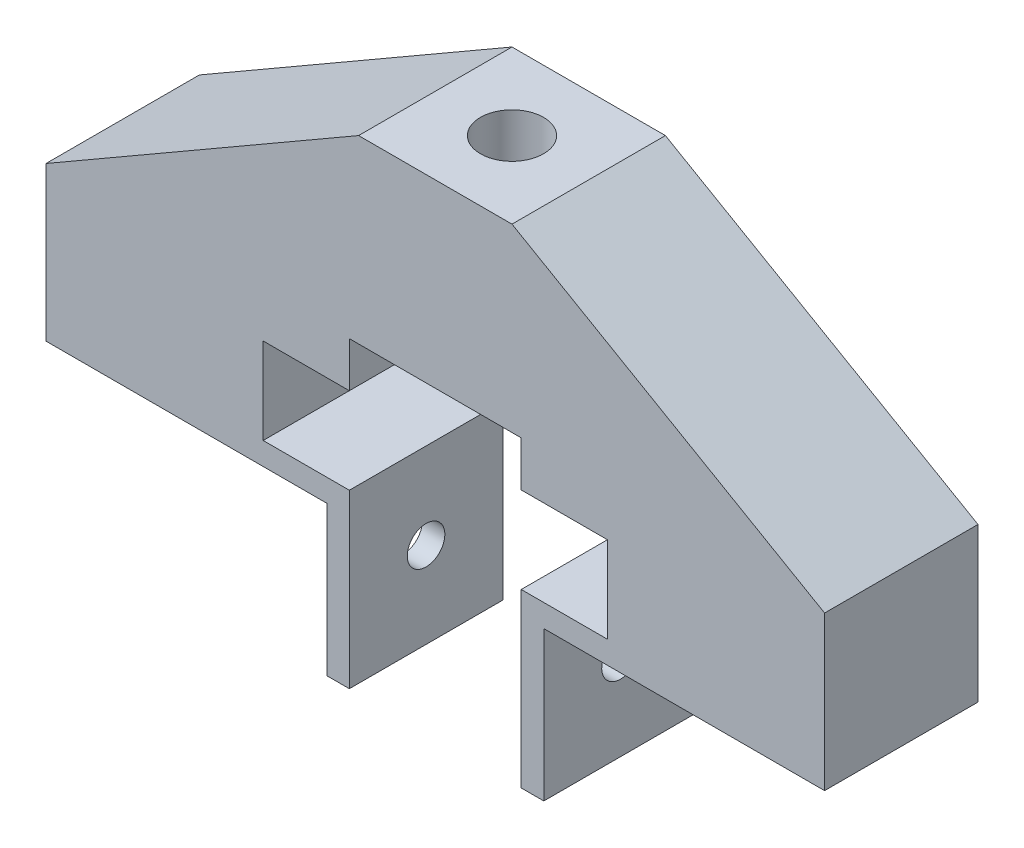
ISO-10303-21;
HEADER;
FILE_DESCRIPTION(('STEP AP214'),'2;1');
FILE_NAME('part.step','',(''),(''),'','','');
FILE_SCHEMA(('AUTOMOTIVE_DESIGN { 1 0 10303 214 1 1 1 1 }'));
ENDSEC;
DATA;
#1=APPLICATION_CONTEXT('core data for automotive mechanical design processes');
#2=APPLICATION_PROTOCOL_DEFINITION('international standard','automotive_design',2000,#1);
#3=PRODUCT_CONTEXT('',#1,'mechanical');
#4=PRODUCT('Part','Part','',(#3));
#5=PRODUCT_RELATED_PRODUCT_CATEGORY('part','',(#4));
#6=PRODUCT_DEFINITION_FORMATION('','',#4);
#7=PRODUCT_DEFINITION_CONTEXT('part definition',#1,'design');
#8=PRODUCT_DEFINITION('design','',#6,#7);
#9=PRODUCT_DEFINITION_SHAPE('','',#8);
#10=(LENGTH_UNIT() NAMED_UNIT(*) SI_UNIT(.MILLI.,.METRE.));
#11=(NAMED_UNIT(*) PLANE_ANGLE_UNIT() SI_UNIT($,.RADIAN.));
#12=(NAMED_UNIT(*) SI_UNIT($,.STERADIAN.) SOLID_ANGLE_UNIT());
#13=UNCERTAINTY_MEASURE_WITH_UNIT(LENGTH_MEASURE(1.E-05),#10,'distance_accuracy_value','');
#14=(GEOMETRIC_REPRESENTATION_CONTEXT(3) GLOBAL_UNCERTAINTY_ASSIGNED_CONTEXT((#13)) GLOBAL_UNIT_ASSIGNED_CONTEXT((#10,
#11,#12)) REPRESENTATION_CONTEXT('',''));
#15=CARTESIAN_POINT('',(0.,0.,0.));
#16=DIRECTION('',(0.,0.,1.));
#17=DIRECTION('',(1.,0.,0.));
#18=AXIS2_PLACEMENT_3D('',#15,#16,#17);
#19=CARTESIAN_POINT('',(-24.05,0.,34.));
#20=DIRECTION('',(1.,0.,0.));
#21=DIRECTION('',(0.,1.,0.));
#22=AXIS2_PLACEMENT_3D('',#19,#20,#21);
#23=PLANE('',#22);
#24=CARTESIAN_POINT('',(-24.05,-14.05,17.));
#25=DIRECTION('',(1.,0.,0.));
#26=DIRECTION('',(0.,1.,0.));
#27=AXIS2_PLACEMENT_3D('',#24,#25,#26);
#28=CIRCLE('',#27,4.1656);
#29=CARTESIAN_POINT('',(-24.05,-9.88439999999997,17.));
#30=VERTEX_POINT('',#29);
#31=EDGE_CURVE('E392',#30,#30,#28,.T.);
#32=ORIENTED_EDGE('',*,*,#31,.T.);
#33=EDGE_LOOP('',(#32));
#34=FACE_BOUND('',#33,.T.);
#35=DIRECTION('',(0.,-1.,0.));
#36=VECTOR('',#35,1.);
#37=CARTESIAN_POINT('',(-24.05,0.,0.));
#38=LINE('',#37,#36);
#39=CARTESIAN_POINT('',(-24.05,0.,0.));
#40=VERTEX_POINT('',#39);
#41=CARTESIAN_POINT('',(-24.05,-33.1,0.));
#42=VERTEX_POINT('',#41);
#43=EDGE_CURVE('E214',#40,#42,#38,.T.);
#44=ORIENTED_EDGE('',*,*,#43,.T.);
#45=DIRECTION('',(0.,0.,-1.));
#46=VECTOR('',#45,1.);
#47=CARTESIAN_POINT('',(-24.05,-33.1,34.));
#48=LINE('',#47,#46);
#49=CARTESIAN_POINT('',(-24.05,-33.1,34.));
#50=VERTEX_POINT('',#49);
#51=EDGE_CURVE('E11',#50,#42,#48,.T.);
#52=ORIENTED_EDGE('',*,*,#51,.F.);
#53=DIRECTION('',(0.,-1.,0.));
#54=VECTOR('',#53,1.);
#55=CARTESIAN_POINT('',(-24.05,0.,34.));
#56=LINE('',#55,#54);
#57=CARTESIAN_POINT('',(-24.05,0.,34.));
#58=VERTEX_POINT('',#57);
#59=EDGE_CURVE('E257',#58,#50,#56,.T.);
#60=ORIENTED_EDGE('',*,*,#59,.F.);
#61=DIRECTION('',(0.,0.,-1.));
#62=VECTOR('',#61,1.);
#63=CARTESIAN_POINT('',(-24.05,0.,34.));
#64=LINE('',#63,#62);
#65=EDGE_CURVE('E210',#58,#40,#64,.T.);
#66=ORIENTED_EDGE('',*,*,#65,.T.);
#67=EDGE_LOOP('',(#44,#52,#60,#66));
#68=FACE_BOUND('',#67,.T.);
#69=ADVANCED_FACE('F34',(#34,#68),#23,.F.);
#70=CARTESIAN_POINT('',(-24.05,-33.1,34.));
#71=DIRECTION('',(0.,1.,0.));
#72=DIRECTION('',(0.,0.,1.));
#73=AXIS2_PLACEMENT_3D('',#70,#71,#72);
#74=PLANE('',#73);
#75=DIRECTION('',(1.,0.,0.));
#76=VECTOR('',#75,1.);
#77=CARTESIAN_POINT('',(-24.05,-33.1,0.));
#78=LINE('',#77,#76);
#79=CARTESIAN_POINT('',(-19.05,-33.1,0.));
#80=VERTEX_POINT('',#79);
#81=EDGE_CURVE('E217',#42,#80,#78,.T.);
#82=ORIENTED_EDGE('',*,*,#81,.T.);
#83=DIRECTION('',(0.,0.,-1.));
#84=VECTOR('',#83,1.);
#85=CARTESIAN_POINT('',(-19.05,-33.1,34.));
#86=LINE('',#85,#84);
#87=CARTESIAN_POINT('',(-19.05,-33.1,34.));
#88=VERTEX_POINT('',#87);
#89=EDGE_CURVE('E42',#88,#80,#86,.T.);
#90=ORIENTED_EDGE('',*,*,#89,.F.);
#91=DIRECTION('',(1.,0.,0.));
#92=VECTOR('',#91,1.);
#93=CARTESIAN_POINT('',(-24.05,-33.1,34.));
#94=LINE('',#93,#92);
#95=EDGE_CURVE('E135',#50,#88,#94,.T.);
#96=ORIENTED_EDGE('',*,*,#95,.F.);
#97=ORIENTED_EDGE('',*,*,#51,.T.);
#98=EDGE_LOOP('',(#82,#90,#96,#97));
#99=FACE_BOUND('',#98,.T.);
#100=ADVANCED_FACE('F385',(#99),#74,.F.);
#101=CARTESIAN_POINT('',(-19.05,-33.1,34.));
#102=DIRECTION('',(-1.,0.,0.));
#103=DIRECTION('',(0.,-1.,0.));
#104=AXIS2_PLACEMENT_3D('',#101,#102,#103);
#105=PLANE('',#104);
#106=CARTESIAN_POINT('',(-19.05,-14.05,17.));
#107=DIRECTION('',(-1.,0.,0.));
#108=DIRECTION('',(0.,-1.,0.));
#109=AXIS2_PLACEMENT_3D('',#106,#107,#108);
#110=CIRCLE('',#109,4.1656);
#111=CARTESIAN_POINT('',(-19.05,-18.2156,17.));
#112=VERTEX_POINT('',#111);
#113=EDGE_CURVE('E395',#112,#112,#110,.T.);
#114=ORIENTED_EDGE('',*,*,#113,.T.);
#115=EDGE_LOOP('',(#114));
#116=FACE_BOUND('',#115,.T.);
#117=DIRECTION('',(0.,1.,0.));
#118=VECTOR('',#117,1.);
#119=CARTESIAN_POINT('',(-19.05,-33.1,0.));
#120=LINE('',#119,#118);
#121=CARTESIAN_POINT('',(-19.05,5.00000000000001,0.));
#122=VERTEX_POINT('',#121);
#123=EDGE_CURVE('E220',#80,#122,#120,.T.);
#124=ORIENTED_EDGE('',*,*,#123,.T.);
#125=DIRECTION('',(0.,0.,-1.));
#126=VECTOR('',#125,1.);
#127=CARTESIAN_POINT('',(-19.05,5.00000000000001,34.));
#128=LINE('',#127,#126);
#129=CARTESIAN_POINT('',(-19.05,5.00000000000001,34.));
#130=VERTEX_POINT('',#129);
#131=EDGE_CURVE('E306',#130,#122,#128,.T.);
#132=ORIENTED_EDGE('',*,*,#131,.F.);
#133=DIRECTION('',(0.,1.,0.));
#134=VECTOR('',#133,1.);
#135=CARTESIAN_POINT('',(-19.05,-33.1,34.));
#136=LINE('',#135,#134);
#137=EDGE_CURVE('E314',#88,#130,#136,.T.);
#138=ORIENTED_EDGE('',*,*,#137,.F.);
#139=ORIENTED_EDGE('',*,*,#89,.T.);
#140=EDGE_LOOP('',(#124,#132,#138,#139));
#141=FACE_BOUND('',#140,.T.);
#142=ADVANCED_FACE('F312',(#116,#141),#105,.F.);
#143=CARTESIAN_POINT('',(-19.05,5.00000000000001,34.));
#144=DIRECTION('',(0.,-1.,0.));
#145=DIRECTION('',(1.,0.,0.));
#146=AXIS2_PLACEMENT_3D('',#143,#144,#145);
#147=PLANE('',#146);
#148=DIRECTION('',(-1.,0.,0.));
#149=VECTOR('',#148,1.);
#150=CARTESIAN_POINT('',(-19.05,5.00000000000001,0.));
#151=LINE('',#150,#149);
#152=CARTESIAN_POINT('',(-38.15,5.00000000000001,0.));
#153=VERTEX_POINT('',#152);
#154=EDGE_CURVE('E222',#122,#153,#151,.T.);
#155=ORIENTED_EDGE('',*,*,#154,.T.);
#156=DIRECTION('',(0.,0.,-1.));
#157=VECTOR('',#156,1.);
#158=CARTESIAN_POINT('',(-38.15,5.00000000000001,34.));
#159=LINE('',#158,#157);
#160=CARTESIAN_POINT('',(-38.15,5.00000000000001,34.));
#161=VERTEX_POINT('',#160);
#162=EDGE_CURVE('E303',#161,#153,#159,.T.);
#163=ORIENTED_EDGE('',*,*,#162,.F.);
#164=DIRECTION('',(-1.,0.,0.));
#165=VECTOR('',#164,1.);
#166=CARTESIAN_POINT('',(-19.05,5.00000000000001,34.));
#167=LINE('',#166,#165);
#168=EDGE_CURVE('E332',#130,#161,#167,.T.);
#169=ORIENTED_EDGE('',*,*,#168,.F.);
#170=ORIENTED_EDGE('',*,*,#131,.T.);
#171=EDGE_LOOP('',(#155,#163,#169,#170));
#172=FACE_BOUND('',#171,.T.);
#173=ADVANCED_FACE('F323',(#172),#147,.F.);
#174=CARTESIAN_POINT('',(-38.15,5.00000000000001,34.));
#175=DIRECTION('',(-1.,0.,0.));
#176=DIRECTION('',(0.,0.,1.));
#177=AXIS2_PLACEMENT_3D('',#174,#175,#176);
#178=PLANE('',#177);
#179=DIRECTION('',(0.,1.,0.));
#180=VECTOR('',#179,1.);
#181=CARTESIAN_POINT('',(-38.15,5.00000000000001,0.));
#182=LINE('',#181,#180);
#183=CARTESIAN_POINT('',(-38.15,24.1,0.));
#184=VERTEX_POINT('',#183);
#185=EDGE_CURVE('E224',#153,#184,#182,.T.);
#186=ORIENTED_EDGE('',*,*,#185,.T.);
#187=DIRECTION('',(0.,0.,-1.));
#188=VECTOR('',#187,1.);
#189=CARTESIAN_POINT('',(-38.15,24.1,34.));
#190=LINE('',#189,#188);
#191=CARTESIAN_POINT('',(-38.15,24.1,34.));
#192=VERTEX_POINT('',#191);
#193=EDGE_CURVE('E300',#192,#184,#190,.T.);
#194=ORIENTED_EDGE('',*,*,#193,.F.);
#195=DIRECTION('',(0.,1.,0.));
#196=VECTOR('',#195,1.);
#197=CARTESIAN_POINT('',(-38.15,5.00000000000001,34.));
#198=LINE('',#197,#196);
#199=EDGE_CURVE('E329',#161,#192,#198,.T.);
#200=ORIENTED_EDGE('',*,*,#199,.F.);
#201=ORIENTED_EDGE('',*,*,#162,.T.);
#202=EDGE_LOOP('',(#186,#194,#200,#201));
#203=FACE_BOUND('',#202,.T.);
#204=ADVANCED_FACE('F327',(#203),#178,.F.);
#205=CARTESIAN_POINT('',(-38.15,24.1,34.));
#206=DIRECTION('',(0.,1.,0.));
#207=DIRECTION('',(0.,0.,1.));
#208=AXIS2_PLACEMENT_3D('',#205,#206,#207);
#209=PLANE('',#208);
#210=DIRECTION('',(1.,0.,0.));
#211=VECTOR('',#210,1.);
#212=CARTESIAN_POINT('',(-38.15,24.1,0.));
#213=LINE('',#212,#211);
#214=CARTESIAN_POINT('',(-19.05,24.1,0.));
#215=VERTEX_POINT('',#214);
#216=EDGE_CURVE('E226',#184,#215,#213,.T.);
#217=ORIENTED_EDGE('',*,*,#216,.T.);
#218=DIRECTION('',(0.,0.,-1.));
#219=VECTOR('',#218,1.);
#220=CARTESIAN_POINT('',(-19.05,24.1,34.));
#221=LINE('',#220,#219);
#222=CARTESIAN_POINT('',(-19.05,24.1,34.));
#223=VERTEX_POINT('',#222);
#224=EDGE_CURVE('E297',#223,#215,#221,.T.);
#225=ORIENTED_EDGE('',*,*,#224,.F.);
#226=DIRECTION('',(1.,0.,0.));
#227=VECTOR('',#226,1.);
#228=CARTESIAN_POINT('',(-38.15,24.1,34.));
#229=LINE('',#228,#227);
#230=EDGE_CURVE('E331',#192,#223,#229,.T.);
#231=ORIENTED_EDGE('',*,*,#230,.F.);
#232=ORIENTED_EDGE('',*,*,#193,.T.);
#233=EDGE_LOOP('',(#217,#225,#231,#232));
#234=FACE_BOUND('',#233,.T.);
#235=ADVANCED_FACE('F469',(#234),#209,.F.);
#236=CARTESIAN_POINT('',(-19.05,24.1,34.));
#237=DIRECTION('',(-1.,0.,0.));
#238=DIRECTION('',(0.,-1.,0.));
#239=AXIS2_PLACEMENT_3D('',#236,#237,#238);
#240=PLANE('',#239);
#241=DIRECTION('',(0.,1.,0.));
#242=VECTOR('',#241,1.);
#243=CARTESIAN_POINT('',(-19.05,24.1,0.));
#244=LINE('',#243,#242);
#245=CARTESIAN_POINT('',(-19.05,34.1,0.));
#246=VERTEX_POINT('',#245);
#247=EDGE_CURVE('E228',#215,#246,#244,.T.);
#248=ORIENTED_EDGE('',*,*,#247,.T.);
#249=DIRECTION('',(0.,0.,-1.));
#250=VECTOR('',#249,1.);
#251=CARTESIAN_POINT('',(-19.05,34.1,34.));
#252=LINE('',#251,#250);
#253=CARTESIAN_POINT('',(-19.05,34.1,34.));
#254=VERTEX_POINT('',#253);
#255=EDGE_CURVE('E294',#254,#246,#252,.T.);
#256=ORIENTED_EDGE('',*,*,#255,.F.);
#257=DIRECTION('',(0.,1.,0.));
#258=VECTOR('',#257,1.);
#259=CARTESIAN_POINT('',(-19.05,24.1,34.));
#260=LINE('',#259,#258);
#261=EDGE_CURVE('E334',#223,#254,#260,.T.);
#262=ORIENTED_EDGE('',*,*,#261,.F.);
#263=ORIENTED_EDGE('',*,*,#224,.T.);
#264=EDGE_LOOP('',(#248,#256,#262,#263));
#265=FACE_BOUND('',#264,.T.);
#266=ADVANCED_FACE('F465',(#265),#240,.F.);
#267=CARTESIAN_POINT('',(-19.05,34.1,34.));
#268=DIRECTION('',(0.,1.,0.));
#269=DIRECTION('',(0.,0.,1.));
#270=AXIS2_PLACEMENT_3D('',#267,#268,#269);
#271=PLANE('',#270);
#272=DIRECTION('',(1.,0.,0.));
#273=VECTOR('',#272,1.);
#274=CARTESIAN_POINT('',(-19.05,34.1,0.));
#275=LINE('',#274,#273);
#276=CARTESIAN_POINT('',(19.05,34.1,0.));
#277=VERTEX_POINT('',#276);
#278=EDGE_CURVE('E230',#246,#277,#275,.T.);
#279=ORIENTED_EDGE('',*,*,#278,.T.);
#280=DIRECTION('',(0.,0.,-1.));
#281=VECTOR('',#280,1.);
#282=CARTESIAN_POINT('',(19.05,34.1,34.));
#283=LINE('',#282,#281);
#284=CARTESIAN_POINT('',(19.05,34.1,34.));
#285=VERTEX_POINT('',#284);
#286=EDGE_CURVE('E291',#285,#277,#283,.T.);
#287=ORIENTED_EDGE('',*,*,#286,.F.);
#288=DIRECTION('',(1.,0.,0.));
#289=VECTOR('',#288,1.);
#290=CARTESIAN_POINT('',(-19.05,34.1,34.));
#291=LINE('',#290,#289);
#292=EDGE_CURVE('E340',#254,#285,#291,.T.);
#293=ORIENTED_EDGE('',*,*,#292,.F.);
#294=ORIENTED_EDGE('',*,*,#255,.T.);
#295=EDGE_LOOP('',(#279,#287,#293,#294));
#296=FACE_BOUND('',#295,.T.);
#297=ADVANCED_FACE('F461',(#296),#271,.F.);
#298=CARTESIAN_POINT('',(19.05,34.1,34.));
#299=DIRECTION('',(1.,0.,0.));
#300=DIRECTION('',(0.,1.,0.));
#301=AXIS2_PLACEMENT_3D('',#298,#299,#300);
#302=PLANE('',#301);
#303=DIRECTION('',(0.,-1.,0.));
#304=VECTOR('',#303,1.);
#305=CARTESIAN_POINT('',(19.05,34.1,0.));
#306=LINE('',#305,#304);
#307=CARTESIAN_POINT('',(19.05,24.1,0.));
#308=VERTEX_POINT('',#307);
#309=EDGE_CURVE('E232',#277,#308,#306,.T.);
#310=ORIENTED_EDGE('',*,*,#309,.T.);
#311=DIRECTION('',(0.,0.,-1.));
#312=VECTOR('',#311,1.);
#313=CARTESIAN_POINT('',(19.05,24.1,34.));
#314=LINE('',#313,#312);
#315=CARTESIAN_POINT('',(19.05,24.1,34.));
#316=VERTEX_POINT('',#315);
#317=EDGE_CURVE('E288',#316,#308,#314,.T.);
#318=ORIENTED_EDGE('',*,*,#317,.F.);
#319=DIRECTION('',(0.,-1.,0.));
#320=VECTOR('',#319,1.);
#321=CARTESIAN_POINT('',(19.05,34.1,34.));
#322=LINE('',#321,#320);
#323=EDGE_CURVE('E342',#285,#316,#322,.T.);
#324=ORIENTED_EDGE('',*,*,#323,.F.);
#325=ORIENTED_EDGE('',*,*,#286,.T.);
#326=EDGE_LOOP('',(#310,#318,#324,#325));
#327=FACE_BOUND('',#326,.T.);
#328=ADVANCED_FACE('F457',(#327),#302,.F.);
#329=CARTESIAN_POINT('',(19.05,24.1,34.));
#330=DIRECTION('',(0.,1.,0.));
#331=DIRECTION('',(0.,0.,1.));
#332=AXIS2_PLACEMENT_3D('',#329,#330,#331);
#333=PLANE('',#332);
#334=DIRECTION('',(1.,0.,0.));
#335=VECTOR('',#334,1.);
#336=CARTESIAN_POINT('',(19.05,24.1,0.));
#337=LINE('',#336,#335);
#338=CARTESIAN_POINT('',(38.15,24.1,0.));
#339=VERTEX_POINT('',#338);
#340=EDGE_CURVE('E234',#308,#339,#337,.T.);
#341=ORIENTED_EDGE('',*,*,#340,.T.);
#342=DIRECTION('',(0.,0.,-1.));
#343=VECTOR('',#342,1.);
#344=CARTESIAN_POINT('',(38.15,24.1,34.));
#345=LINE('',#344,#343);
#346=CARTESIAN_POINT('',(38.15,24.1,34.));
#347=VERTEX_POINT('',#346);
#348=EDGE_CURVE('E285',#347,#339,#345,.T.);
#349=ORIENTED_EDGE('',*,*,#348,.F.);
#350=DIRECTION('',(1.,0.,0.));
#351=VECTOR('',#350,1.);
#352=CARTESIAN_POINT('',(19.05,24.1,34.));
#353=LINE('',#352,#351);
#354=EDGE_CURVE('E344',#316,#347,#353,.T.);
#355=ORIENTED_EDGE('',*,*,#354,.F.);
#356=ORIENTED_EDGE('',*,*,#317,.T.);
#357=EDGE_LOOP('',(#341,#349,#355,#356));
#358=FACE_BOUND('',#357,.T.);
#359=ADVANCED_FACE('F453',(#358),#333,.F.);
#360=CARTESIAN_POINT('',(38.15,24.1,34.));
#361=DIRECTION('',(1.,0.,0.));
#362=DIRECTION('',(0.,1.,0.));
#363=AXIS2_PLACEMENT_3D('',#360,#361,#362);
#364=PLANE('',#363);
#365=DIRECTION('',(0.,-1.,0.));
#366=VECTOR('',#365,1.);
#367=CARTESIAN_POINT('',(38.15,24.1,0.));
#368=LINE('',#367,#366);
#369=CARTESIAN_POINT('',(38.15,5.00000000000001,0.));
#370=VERTEX_POINT('',#369);
#371=EDGE_CURVE('E236',#339,#370,#368,.T.);
#372=ORIENTED_EDGE('',*,*,#371,.T.);
#373=DIRECTION('',(0.,0.,-1.));
#374=VECTOR('',#373,1.);
#375=CARTESIAN_POINT('',(38.15,5.00000000000001,34.));
#376=LINE('',#375,#374);
#377=CARTESIAN_POINT('',(38.15,5.00000000000001,34.));
#378=VERTEX_POINT('',#377);
#379=EDGE_CURVE('E282',#378,#370,#376,.T.);
#380=ORIENTED_EDGE('',*,*,#379,.F.);
#381=DIRECTION('',(0.,-1.,0.));
#382=VECTOR('',#381,1.);
#383=CARTESIAN_POINT('',(38.15,24.1,34.));
#384=LINE('',#383,#382);
#385=EDGE_CURVE('E346',#347,#378,#384,.T.);
#386=ORIENTED_EDGE('',*,*,#385,.F.);
#387=ORIENTED_EDGE('',*,*,#348,.T.);
#388=EDGE_LOOP('',(#372,#380,#386,#387));
#389=FACE_BOUND('',#388,.T.);
#390=ADVANCED_FACE('F449',(#389),#364,.F.);
#391=CARTESIAN_POINT('',(38.15,5.00000000000001,34.));
#392=DIRECTION('',(0.,-1.,0.));
#393=DIRECTION('',(1.,0.,0.));
#394=AXIS2_PLACEMENT_3D('',#391,#392,#393);
#395=PLANE('',#394);
#396=DIRECTION('',(-1.,0.,0.));
#397=VECTOR('',#396,1.);
#398=CARTESIAN_POINT('',(38.15,5.00000000000001,0.));
#399=LINE('',#398,#397);
#400=CARTESIAN_POINT('',(19.05,5.00000000000001,0.));
#401=VERTEX_POINT('',#400);
#402=EDGE_CURVE('E238',#370,#401,#399,.T.);
#403=ORIENTED_EDGE('',*,*,#402,.T.);
#404=DIRECTION('',(0.,0.,-1.));
#405=VECTOR('',#404,1.);
#406=CARTESIAN_POINT('',(19.05,5.00000000000001,34.));
#407=LINE('',#406,#405);
#408=CARTESIAN_POINT('',(19.05,5.00000000000001,34.));
#409=VERTEX_POINT('',#408);
#410=EDGE_CURVE('E279',#409,#401,#407,.T.);
#411=ORIENTED_EDGE('',*,*,#410,.F.);
#412=DIRECTION('',(-1.,0.,0.));
#413=VECTOR('',#412,1.);
#414=CARTESIAN_POINT('',(38.15,5.00000000000001,34.));
#415=LINE('',#414,#413);
#416=EDGE_CURVE('E348',#378,#409,#415,.T.);
#417=ORIENTED_EDGE('',*,*,#416,.F.);
#418=ORIENTED_EDGE('',*,*,#379,.T.);
#419=EDGE_LOOP('',(#403,#411,#417,#418));
#420=FACE_BOUND('',#419,.T.);
#421=ADVANCED_FACE('F445',(#420),#395,.F.);
#422=CARTESIAN_POINT('',(19.05,5.00000000000001,34.));
#423=DIRECTION('',(1.,0.,0.));
#424=DIRECTION('',(0.,1.,0.));
#425=AXIS2_PLACEMENT_3D('',#422,#423,#424);
#426=PLANE('',#425);
#427=CARTESIAN_POINT('',(19.05,-14.05,17.));
#428=DIRECTION('',(1.,0.,0.));
#429=DIRECTION('',(0.,1.,0.));
#430=AXIS2_PLACEMENT_3D('',#427,#428,#429);
#431=CIRCLE('',#430,4.1656);
#432=CARTESIAN_POINT('',(19.05,-9.88439999999999,17.));
#433=VERTEX_POINT('',#432);
#434=EDGE_CURVE('E400',#433,#433,#431,.T.);
#435=ORIENTED_EDGE('',*,*,#434,.T.);
#436=EDGE_LOOP('',(#435));
#437=FACE_BOUND('',#436,.T.);
#438=DIRECTION('',(0.,-1.,0.));
#439=VECTOR('',#438,1.);
#440=CARTESIAN_POINT('',(19.05,5.00000000000001,0.));
#441=LINE('',#440,#439);
#442=CARTESIAN_POINT('',(19.05,-33.1,0.));
#443=VERTEX_POINT('',#442);
#444=EDGE_CURVE('E240',#401,#443,#441,.T.);
#445=ORIENTED_EDGE('',*,*,#444,.T.);
#446=DIRECTION('',(0.,0.,-1.));
#447=VECTOR('',#446,1.);
#448=CARTESIAN_POINT('',(19.05,-33.1,34.));
#449=LINE('',#448,#447);
#450=CARTESIAN_POINT('',(19.05,-33.1,34.));
#451=VERTEX_POINT('',#450);
#452=EDGE_CURVE('E276',#451,#443,#449,.T.);
#453=ORIENTED_EDGE('',*,*,#452,.F.);
#454=DIRECTION('',(0.,-1.,0.));
#455=VECTOR('',#454,1.);
#456=CARTESIAN_POINT('',(19.05,5.00000000000001,34.));
#457=LINE('',#456,#455);
#458=EDGE_CURVE('E350',#409,#451,#457,.T.);
#459=ORIENTED_EDGE('',*,*,#458,.F.);
#460=ORIENTED_EDGE('',*,*,#410,.T.);
#461=EDGE_LOOP('',(#445,#453,#459,#460));
#462=FACE_BOUND('',#461,.T.);
#463=ADVANCED_FACE('F441',(#437,#462),#426,.F.);
#464=CARTESIAN_POINT('',(19.05,-33.1,34.));
#465=DIRECTION('',(0.,1.,0.));
#466=DIRECTION('',(0.,0.,1.));
#467=AXIS2_PLACEMENT_3D('',#464,#465,#466);
#468=PLANE('',#467);
#469=DIRECTION('',(1.,0.,0.));
#470=VECTOR('',#469,1.);
#471=CARTESIAN_POINT('',(19.05,-33.1,0.));
#472=LINE('',#471,#470);
#473=CARTESIAN_POINT('',(24.05,-33.1,0.));
#474=VERTEX_POINT('',#473);
#475=EDGE_CURVE('E242',#443,#474,#472,.T.);
#476=ORIENTED_EDGE('',*,*,#475,.T.);
#477=DIRECTION('',(0.,0.,-1.));
#478=VECTOR('',#477,1.);
#479=CARTESIAN_POINT('',(24.05,-33.1,34.));
#480=LINE('',#479,#478);
#481=CARTESIAN_POINT('',(24.05,-33.1,34.));
#482=VERTEX_POINT('',#481);
#483=EDGE_CURVE('E273',#482,#474,#480,.T.);
#484=ORIENTED_EDGE('',*,*,#483,.F.);
#485=DIRECTION('',(1.,0.,0.));
#486=VECTOR('',#485,1.);
#487=CARTESIAN_POINT('',(19.05,-33.1,34.));
#488=LINE('',#487,#486);
#489=EDGE_CURVE('E352',#451,#482,#488,.T.);
#490=ORIENTED_EDGE('',*,*,#489,.F.);
#491=ORIENTED_EDGE('',*,*,#452,.T.);
#492=EDGE_LOOP('',(#476,#484,#490,#491));
#493=FACE_BOUND('',#492,.T.);
#494=ADVANCED_FACE('F437',(#493),#468,.F.);
#495=CARTESIAN_POINT('',(24.05,-33.1,34.));
#496=DIRECTION('',(-1.,0.,0.));
#497=DIRECTION('',(0.,-1.,0.));
#498=AXIS2_PLACEMENT_3D('',#495,#496,#497);
#499=PLANE('',#498);
#500=CARTESIAN_POINT('',(24.05,-14.05,17.));
#501=DIRECTION('',(1.,0.,0.));
#502=DIRECTION('',(0.,1.,0.));
#503=AXIS2_PLACEMENT_3D('',#500,#501,#502);
#504=CIRCLE('',#503,4.1656);
#505=CARTESIAN_POINT('',(24.05,-9.88439999999999,17.));
#506=VERTEX_POINT('',#505);
#507=EDGE_CURVE('E656',#506,#506,#504,.T.);
#508=ORIENTED_EDGE('',*,*,#507,.F.);
#509=EDGE_LOOP('',(#508));
#510=FACE_BOUND('',#509,.T.);
#511=DIRECTION('',(0.,1.,0.));
#512=VECTOR('',#511,1.);
#513=CARTESIAN_POINT('',(24.05,-33.1,0.));
#514=LINE('',#513,#512);
#515=CARTESIAN_POINT('',(24.05,0.,0.));
#516=VERTEX_POINT('',#515);
#517=EDGE_CURVE('E244',#474,#516,#514,.T.);
#518=ORIENTED_EDGE('',*,*,#517,.T.);
#519=DIRECTION('',(0.,0.,-1.));
#520=VECTOR('',#519,1.);
#521=CARTESIAN_POINT('',(24.05,0.,34.));
#522=LINE('',#521,#520);
#523=CARTESIAN_POINT('',(24.05,0.,34.));
#524=VERTEX_POINT('',#523);
#525=EDGE_CURVE('E270',#524,#516,#522,.T.);
#526=ORIENTED_EDGE('',*,*,#525,.F.);
#527=DIRECTION('',(0.,1.,0.));
#528=VECTOR('',#527,1.);
#529=CARTESIAN_POINT('',(24.05,-33.1,34.));
#530=LINE('',#529,#528);
#531=EDGE_CURVE('E354',#482,#524,#530,.T.);
#532=ORIENTED_EDGE('',*,*,#531,.F.);
#533=ORIENTED_EDGE('',*,*,#483,.T.);
#534=EDGE_LOOP('',(#518,#526,#532,#533));
#535=FACE_BOUND('',#534,.T.);
#536=ADVANCED_FACE('F433',(#510,#535),#499,.F.);
#537=CARTESIAN_POINT('',(24.05,0.,34.));
#538=DIRECTION('',(0.,1.,0.));
#539=DIRECTION('',(-1.,0.,0.));
#540=AXIS2_PLACEMENT_3D('',#537,#538,#539);
#541=PLANE('',#540);
#542=DIRECTION('',(1.,0.,0.));
#543=VECTOR('',#542,1.);
#544=CARTESIAN_POINT('',(24.05,0.,0.));
#545=LINE('',#544,#543);
#546=CARTESIAN_POINT('',(86.2820323027561,0.,0.));
#547=VERTEX_POINT('',#546);
#548=EDGE_CURVE('E246',#516,#547,#545,.T.);
#549=ORIENTED_EDGE('',*,*,#548,.T.);
#550=DIRECTION('',(0.,0.,-1.));
#551=VECTOR('',#550,1.);
#552=CARTESIAN_POINT('',(86.2820323027561,0.,34.));
#553=LINE('',#552,#551);
#554=CARTESIAN_POINT('',(86.2820323027561,0.,34.));
#555=VERTEX_POINT('',#554);
#556=EDGE_CURVE('E267',#555,#547,#553,.T.);
#557=ORIENTED_EDGE('',*,*,#556,.F.);
#558=DIRECTION('',(1.,0.,0.));
#559=VECTOR('',#558,1.);
#560=CARTESIAN_POINT('',(24.05,0.,34.));
#561=LINE('',#560,#559);
#562=EDGE_CURVE('E356',#524,#555,#561,.T.);
#563=ORIENTED_EDGE('',*,*,#562,.F.);
#564=ORIENTED_EDGE('',*,*,#525,.T.);
#565=EDGE_LOOP('',(#549,#557,#563,#564));
#566=FACE_BOUND('',#565,.T.);
#567=ADVANCED_FACE('F429',(#566),#541,.F.);
#568=CARTESIAN_POINT('',(86.2820323027561,34.1,34.));
#569=DIRECTION('',(-1.,0.,0.));
#570=DIRECTION('',(0.,0.,1.));
#571=AXIS2_PLACEMENT_3D('',#568,#569,#570);
#572=PLANE('',#571);
#573=DIRECTION('',(0.,1.,0.));
#574=VECTOR('',#573,1.);
#575=CARTESIAN_POINT('',(86.2820323027561,34.1,0.));
#576=LINE('',#575,#574);
#577=CARTESIAN_POINT('',(86.2820323027561,34.1,0.));
#578=VERTEX_POINT('',#577);
#579=EDGE_CURVE('E248',#547,#578,#576,.T.);
#580=ORIENTED_EDGE('',*,*,#579,.T.);
#581=DIRECTION('',(0.,0.,-1.));
#582=VECTOR('',#581,1.);
#583=CARTESIAN_POINT('',(86.2820323027561,34.1,34.));
#584=LINE('',#583,#582);
#585=CARTESIAN_POINT('',(86.2820323027561,34.1,34.));
#586=VERTEX_POINT('',#585);
#587=EDGE_CURVE('E264',#586,#578,#584,.T.);
#588=ORIENTED_EDGE('',*,*,#587,.F.);
#589=DIRECTION('',(0.,1.,0.));
#590=VECTOR('',#589,1.);
#591=CARTESIAN_POINT('',(86.2820323027561,34.1,34.));
#592=LINE('',#591,#590);
#593=EDGE_CURVE('E358',#555,#586,#592,.T.);
#594=ORIENTED_EDGE('',*,*,#593,.F.);
#595=ORIENTED_EDGE('',*,*,#556,.T.);
#596=EDGE_LOOP('',(#580,#588,#594,#595));
#597=FACE_BOUND('',#596,.T.);
#598=ADVANCED_FACE('F424',(#597),#572,.F.);
#599=CARTESIAN_POINT('',(86.2820323027561,34.1,34.));
#600=DIRECTION('',(-0.499999999999995,-0.866025403784442,0.));
#601=DIRECTION('',(0.866025403784442,-0.499999999999995,0.));
#602=AXIS2_PLACEMENT_3D('',#599,#600,#601);
#603=PLANE('',#602);
#604=DIRECTION('',(-0.866025403784442,0.499999999999995,0.));
#605=VECTOR('',#604,1.);
#606=CARTESIAN_POINT('',(86.2820323027561,34.1,0.));
#607=LINE('',#606,#605);
#608=CARTESIAN_POINT('',(17.,74.1,0.));
#609=VERTEX_POINT('',#608);
#610=EDGE_CURVE('E250',#578,#609,#607,.T.);
#611=ORIENTED_EDGE('',*,*,#610,.T.);
#612=DIRECTION('',(0.,0.,-1.));
#613=VECTOR('',#612,1.);
#614=CARTESIAN_POINT('',(17.,74.1,34.));
#615=LINE('',#614,#613);
#616=CARTESIAN_POINT('',(17.,74.1,34.));
#617=VERTEX_POINT('',#616);
#618=EDGE_CURVE('E261',#617,#609,#615,.T.);
#619=ORIENTED_EDGE('',*,*,#618,.F.);
#620=DIRECTION('',(-0.866025403784442,0.499999999999995,0.));
#621=VECTOR('',#620,1.);
#622=CARTESIAN_POINT('',(86.2820323027561,34.1,34.));
#623=LINE('',#622,#621);
#624=EDGE_CURVE('E360',#586,#617,#623,.T.);
#625=ORIENTED_EDGE('',*,*,#624,.F.);
#626=ORIENTED_EDGE('',*,*,#587,.T.);
#627=EDGE_LOOP('',(#611,#619,#625,#626));
#628=FACE_BOUND('',#627,.T.);
#629=ADVANCED_FACE('F366',(#628),#603,.F.);
#630=CARTESIAN_POINT('',(17.,74.1,34.));
#631=DIRECTION('',(0.,-1.,0.));
#632=DIRECTION('',(0.,0.,-1.));
#633=AXIS2_PLACEMENT_3D('',#630,#631,#632);
#634=PLANE('',#633);
#635=CARTESIAN_POINT('',(0.,74.1,17.));
#636=DIRECTION('',(0.,1.,0.));
#637=DIRECTION('',(0.,0.,1.));
#638=AXIS2_PLACEMENT_3D('',#635,#636,#637);
#639=CIRCLE('',#638,7.);
#640=CARTESIAN_POINT('',(0.,74.1,24.));
#641=VERTEX_POINT('',#640);
#642=EDGE_CURVE('E394',#641,#641,#639,.T.);
#643=ORIENTED_EDGE('',*,*,#642,.F.);
#644=EDGE_LOOP('',(#643));
#645=FACE_BOUND('',#644,.T.);
#646=DIRECTION('',(-1.,0.,0.));
#647=VECTOR('',#646,1.);
#648=CARTESIAN_POINT('',(17.,74.1,0.));
#649=LINE('',#648,#647);
#650=CARTESIAN_POINT('',(-17.,74.1,0.));
#651=VERTEX_POINT('',#650);
#652=EDGE_CURVE('E252',#609,#651,#649,.T.);
#653=ORIENTED_EDGE('',*,*,#652,.T.);
#654=DIRECTION('',(0.,0.,-1.));
#655=VECTOR('',#654,1.);
#656=CARTESIAN_POINT('',(-17.,74.1,34.));
#657=LINE('',#656,#655);
#658=CARTESIAN_POINT('',(-17.,74.1,34.));
#659=VERTEX_POINT('',#658);
#660=EDGE_CURVE('E205',#659,#651,#657,.T.);
#661=ORIENTED_EDGE('',*,*,#660,.F.);
#662=DIRECTION('',(-1.,0.,0.));
#663=VECTOR('',#662,1.);
#664=CARTESIAN_POINT('',(17.,74.1,34.));
#665=LINE('',#664,#663);
#666=EDGE_CURVE('E196',#617,#659,#665,.T.);
#667=ORIENTED_EDGE('',*,*,#666,.F.);
#668=ORIENTED_EDGE('',*,*,#618,.T.);
#669=EDGE_LOOP('',(#653,#661,#667,#668));
#670=FACE_BOUND('',#669,.T.);
#671=ADVANCED_FACE('F370',(#645,#670),#634,.F.);
#672=CARTESIAN_POINT('',(-17.,74.1,34.));
#673=DIRECTION('',(0.499999999999995,-0.866025403784442,0.));
#674=DIRECTION('',(0.866025403784442,0.499999999999995,0.));
#675=AXIS2_PLACEMENT_3D('',#672,#673,#674);
#676=PLANE('',#675);
#677=DIRECTION('',(-0.866025403784441,-0.499999999999995,0.));
#678=VECTOR('',#677,1.);
#679=CARTESIAN_POINT('',(-17.,74.1,0.));
#680=LINE('',#679,#678);
#681=CARTESIAN_POINT('',(-86.2820323027561,34.1,0.));
#682=VERTEX_POINT('',#681);
#683=EDGE_CURVE('E204',#651,#682,#680,.T.);
#684=ORIENTED_EDGE('',*,*,#683,.T.);
#685=DIRECTION('',(0.,0.,-1.));
#686=VECTOR('',#685,1.);
#687=CARTESIAN_POINT('',(-86.2820323027561,34.1,34.));
#688=LINE('',#687,#686);
#689=CARTESIAN_POINT('',(-86.2820323027561,34.1,34.));
#690=VERTEX_POINT('',#689);
#691=EDGE_CURVE('E201',#690,#682,#688,.T.);
#692=ORIENTED_EDGE('',*,*,#691,.F.);
#693=DIRECTION('',(-0.866025403784441,-0.499999999999995,0.));
#694=VECTOR('',#693,1.);
#695=CARTESIAN_POINT('',(-17.,74.1,34.));
#696=LINE('',#695,#694);
#697=EDGE_CURVE('E190',#659,#690,#696,.T.);
#698=ORIENTED_EDGE('',*,*,#697,.F.);
#699=ORIENTED_EDGE('',*,*,#660,.T.);
#700=EDGE_LOOP('',(#684,#692,#698,#699));
#701=FACE_BOUND('',#700,.T.);
#702=ADVANCED_FACE('F202',(#701),#676,.F.);
#703=CARTESIAN_POINT('',(-86.2820323027561,34.1,34.));
#704=DIRECTION('',(1.,0.,0.));
#705=DIRECTION('',(0.,1.,0.));
#706=AXIS2_PLACEMENT_3D('',#703,#704,#705);
#707=PLANE('',#706);
#708=DIRECTION('',(0.,-1.,0.));
#709=VECTOR('',#708,1.);
#710=CARTESIAN_POINT('',(-86.2820323027561,34.1,0.));
#711=LINE('',#710,#709);
#712=CARTESIAN_POINT('',(-86.2820323027561,0.,0.));
#713=VERTEX_POINT('',#712);
#714=EDGE_CURVE('E121',#682,#713,#711,.T.);
#715=ORIENTED_EDGE('',*,*,#714,.T.);
#716=DIRECTION('',(0.,0.,-1.));
#717=VECTOR('',#716,1.);
#718=CARTESIAN_POINT('',(-86.2820323027561,0.,34.));
#719=LINE('',#718,#717);
#720=CARTESIAN_POINT('',(-86.2820323027561,0.,34.));
#721=VERTEX_POINT('',#720);
#722=EDGE_CURVE('E206',#721,#713,#719,.T.);
#723=ORIENTED_EDGE('',*,*,#722,.F.);
#724=DIRECTION('',(0.,-1.,0.));
#725=VECTOR('',#724,1.);
#726=CARTESIAN_POINT('',(-86.2820323027561,34.1,34.));
#727=LINE('',#726,#725);
#728=EDGE_CURVE('E194',#690,#721,#727,.T.);
#729=ORIENTED_EDGE('',*,*,#728,.F.);
#730=ORIENTED_EDGE('',*,*,#691,.T.);
#731=EDGE_LOOP('',(#715,#723,#729,#730));
#732=FACE_BOUND('',#731,.T.);
#733=ADVANCED_FACE('F208',(#732),#707,.F.);
#734=CARTESIAN_POINT('',(-86.2820323027561,0.,34.));
#735=DIRECTION('',(0.,1.,0.));
#736=DIRECTION('',(-1.,0.,0.));
#737=AXIS2_PLACEMENT_3D('',#734,#735,#736);
#738=PLANE('',#737);
#739=DIRECTION('',(1.,0.,0.));
#740=VECTOR('',#739,1.);
#741=CARTESIAN_POINT('',(-86.2820323027561,0.,0.));
#742=LINE('',#741,#740);
#743=EDGE_CURVE('E127',#713,#40,#742,.T.);
#744=ORIENTED_EDGE('',*,*,#743,.T.);
#745=ORIENTED_EDGE('',*,*,#65,.F.);
#746=DIRECTION('',(1.,0.,0.));
#747=VECTOR('',#746,1.);
#748=CARTESIAN_POINT('',(-86.2820323027561,0.,34.));
#749=LINE('',#748,#747);
#750=EDGE_CURVE('E50',#721,#58,#749,.T.);
#751=ORIENTED_EDGE('',*,*,#750,.F.);
#752=ORIENTED_EDGE('',*,*,#722,.T.);
#753=EDGE_LOOP('',(#744,#745,#751,#752));
#754=FACE_BOUND('',#753,.T.);
#755=ADVANCED_FACE('F374',(#754),#738,.F.);
#756=CARTESIAN_POINT('',(0.,0.,34.));
#757=DIRECTION('',(0.,0.,1.));
#758=DIRECTION('',(1.,0.,0.));
#759=AXIS2_PLACEMENT_3D('',#756,#757,#758);
#760=PLANE('',#759);
#761=ORIENTED_EDGE('',*,*,#59,.T.);
#762=ORIENTED_EDGE('',*,*,#95,.T.);
#763=ORIENTED_EDGE('',*,*,#137,.T.);
#764=ORIENTED_EDGE('',*,*,#168,.T.);
#765=ORIENTED_EDGE('',*,*,#199,.T.);
#766=ORIENTED_EDGE('',*,*,#230,.T.);
#767=ORIENTED_EDGE('',*,*,#261,.T.);
#768=ORIENTED_EDGE('',*,*,#292,.T.);
#769=ORIENTED_EDGE('',*,*,#323,.T.);
#770=ORIENTED_EDGE('',*,*,#354,.T.);
#771=ORIENTED_EDGE('',*,*,#385,.T.);
#772=ORIENTED_EDGE('',*,*,#416,.T.);
#773=ORIENTED_EDGE('',*,*,#458,.T.);
#774=ORIENTED_EDGE('',*,*,#489,.T.);
#775=ORIENTED_EDGE('',*,*,#531,.T.);
#776=ORIENTED_EDGE('',*,*,#562,.T.);
#777=ORIENTED_EDGE('',*,*,#593,.T.);
#778=ORIENTED_EDGE('',*,*,#624,.T.);
#779=ORIENTED_EDGE('',*,*,#666,.T.);
#780=ORIENTED_EDGE('',*,*,#697,.T.);
#781=ORIENTED_EDGE('',*,*,#728,.T.);
#782=ORIENTED_EDGE('',*,*,#750,.T.);
#783=EDGE_LOOP('',(#761,#762,#763,#764,#765,#766,#767,#768,#769,#770,#771,#772,#773,#774,#775,
#776,#777,#778,#779,#780,#781,#782));
#784=FACE_BOUND('',#783,.T.);
#785=ADVANCED_FACE('F192',(#784),#760,.T.);
#786=CARTESIAN_POINT('',(0.,0.,0.));
#787=DIRECTION('',(0.,0.,1.));
#788=DIRECTION('',(1.,0.,0.));
#789=AXIS2_PLACEMENT_3D('',#786,#787,#788);
#790=PLANE('',#789);
#791=ORIENTED_EDGE('',*,*,#43,.F.);
#792=ORIENTED_EDGE('',*,*,#743,.F.);
#793=ORIENTED_EDGE('',*,*,#714,.F.);
#794=ORIENTED_EDGE('',*,*,#683,.F.);
#795=ORIENTED_EDGE('',*,*,#652,.F.);
#796=ORIENTED_EDGE('',*,*,#610,.F.);
#797=ORIENTED_EDGE('',*,*,#579,.F.);
#798=ORIENTED_EDGE('',*,*,#548,.F.);
#799=ORIENTED_EDGE('',*,*,#517,.F.);
#800=ORIENTED_EDGE('',*,*,#475,.F.);
#801=ORIENTED_EDGE('',*,*,#444,.F.);
#802=ORIENTED_EDGE('',*,*,#402,.F.);
#803=ORIENTED_EDGE('',*,*,#371,.F.);
#804=ORIENTED_EDGE('',*,*,#340,.F.);
#805=ORIENTED_EDGE('',*,*,#309,.F.);
#806=ORIENTED_EDGE('',*,*,#278,.F.);
#807=ORIENTED_EDGE('',*,*,#247,.F.);
#808=ORIENTED_EDGE('',*,*,#216,.F.);
#809=ORIENTED_EDGE('',*,*,#185,.F.);
#810=ORIENTED_EDGE('',*,*,#154,.F.);
#811=ORIENTED_EDGE('',*,*,#123,.F.);
#812=ORIENTED_EDGE('',*,*,#81,.F.);
#813=EDGE_LOOP('',(#791,#792,#793,#794,#795,#796,#797,#798,#799,#800,#801,#802,#803,#804,#805,
#806,#807,#808,#809,#810,#811,#812));
#814=FACE_BOUND('',#813,.T.);
#815=ADVANCED_FACE('F318',(#814),#790,.F.);
#816=CARTESIAN_POINT('',(0.,39.1,17.));
#817=DIRECTION('',(0.,1.,0.));
#818=DIRECTION('',(0.,0.,1.));
#819=AXIS2_PLACEMENT_3D('',#816,#817,#818);
#820=CYLINDRICAL_SURFACE('',#819,7.);
#821=CARTESIAN_POINT('',(0.,39.1,17.));
#822=DIRECTION('',(0.,1.,0.));
#823=DIRECTION('',(0.,0.,1.));
#824=AXIS2_PLACEMENT_3D('',#821,#822,#823);
#825=CIRCLE('',#824,7.);
#826=CARTESIAN_POINT('',(0.,39.1,24.));
#827=VERTEX_POINT('',#826);
#828=EDGE_CURVE('E218',#827,#827,#825,.T.);
#829=ORIENTED_EDGE('',*,*,#828,.F.);
#830=EDGE_LOOP('',(#829));
#831=FACE_BOUND('',#830,.T.);
#832=ORIENTED_EDGE('',*,*,#642,.T.);
#833=EDGE_LOOP('',(#832));
#834=FACE_BOUND('',#833,.T.);
#835=ADVANCED_FACE('F411',(#831,#834),#820,.F.);
#836=CARTESIAN_POINT('',(0.,39.1,17.));
#837=DIRECTION('',(0.,1.,0.));
#838=DIRECTION('',(0.,0.,1.));
#839=AXIS2_PLACEMENT_3D('',#836,#837,#838);
#840=PLANE('',#839);
#841=ORIENTED_EDGE('',*,*,#828,.T.);
#842=EDGE_LOOP('',(#841));
#843=FACE_BOUND('',#842,.T.);
#844=ADVANCED_FACE('F409',(#843),#840,.T.);
#845=CARTESIAN_POINT('',(-86.2820323027561,-14.0499999999999,17.));
#846=DIRECTION('',(1.,0.,0.));
#847=DIRECTION('',(0.,1.,0.));
#848=AXIS2_PLACEMENT_3D('',#845,#846,#847);
#849=CYLINDRICAL_SURFACE('',#848,4.1656);
#850=ORIENTED_EDGE('',*,*,#507,.T.);
#851=EDGE_LOOP('',(#850));
#852=FACE_BOUND('',#851,.T.);
#853=ORIENTED_EDGE('',*,*,#434,.F.);
#854=EDGE_LOOP('',(#853));
#855=FACE_BOUND('',#854,.T.);
#856=ADVANCED_FACE('F486',(#852,#855),#849,.F.);
#857=ORIENTED_EDGE('',*,*,#113,.F.);
#858=EDGE_LOOP('',(#857));
#859=FACE_BOUND('',#858,.T.);
#860=ORIENTED_EDGE('',*,*,#31,.F.);
#861=EDGE_LOOP('',(#860));
#862=FACE_BOUND('',#861,.T.);
#863=ADVANCED_FACE('F484',(#859,#862),#849,.F.);
#864=CLOSED_SHELL('',(#69,#100,#142,#173,#204,#235,#266,#297,#328,#359,#390,#421,#463,#494,#536,
#567,#598,#629,#671,#702,#733,#755,#785,#815,#835,#844,#856,#863));
#865=MANIFOLD_SOLID_BREP('B2',#864);
#866=ADVANCED_BREP_SHAPE_REPRESENTATION('',(#18,#865),#14);
#867=SHAPE_DEFINITION_REPRESENTATION(#9,#866);
ENDSEC;
END-ISO-10303-21;
